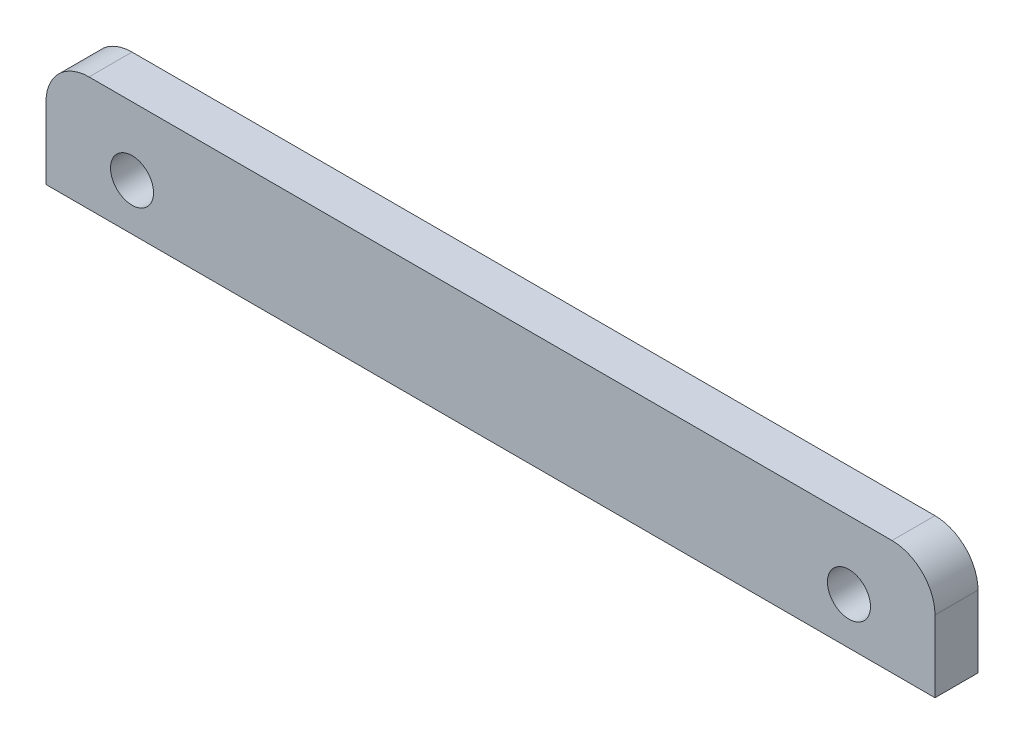
ISO-10303-21;
HEADER;
FILE_DESCRIPTION(('STEP AP214'),'2;1');
FILE_NAME('part.step','',(''),(''),'','','');
FILE_SCHEMA(('AUTOMOTIVE_DESIGN { 1 0 10303 214 1 1 1 1 }'));
ENDSEC;
DATA;
#1=APPLICATION_CONTEXT('core data for automotive mechanical design processes');
#2=APPLICATION_PROTOCOL_DEFINITION('international standard','automotive_design',2000,#1);
#3=PRODUCT_CONTEXT('',#1,'mechanical');
#4=PRODUCT('Part','Part','',(#3));
#5=PRODUCT_RELATED_PRODUCT_CATEGORY('part','',(#4));
#6=PRODUCT_DEFINITION_FORMATION('','',#4);
#7=PRODUCT_DEFINITION_CONTEXT('part definition',#1,'design');
#8=PRODUCT_DEFINITION('design','',#6,#7);
#9=PRODUCT_DEFINITION_SHAPE('','',#8);
#10=(LENGTH_UNIT() NAMED_UNIT(*) SI_UNIT(.MILLI.,.METRE.));
#11=(NAMED_UNIT(*) PLANE_ANGLE_UNIT() SI_UNIT($,.RADIAN.));
#12=(NAMED_UNIT(*) SI_UNIT($,.STERADIAN.) SOLID_ANGLE_UNIT());
#13=UNCERTAINTY_MEASURE_WITH_UNIT(LENGTH_MEASURE(1.E-05),#10,'distance_accuracy_value','');
#14=(GEOMETRIC_REPRESENTATION_CONTEXT(3) GLOBAL_UNCERTAINTY_ASSIGNED_CONTEXT((#13)) GLOBAL_UNIT_ASSIGNED_CONTEXT((#10,
#11,#12)) REPRESENTATION_CONTEXT('',''));
#15=CARTESIAN_POINT('',(0.,0.,0.));
#16=DIRECTION('',(0.,0.,1.));
#17=DIRECTION('',(1.,0.,0.));
#18=AXIS2_PLACEMENT_3D('',#15,#16,#17);
#19=CARTESIAN_POINT('',(-28.,2.5,3.));
#20=DIRECTION('',(0.,0.,1.));
#21=DIRECTION('',(1.,0.,0.));
#22=AXIS2_PLACEMENT_3D('',#19,#20,#21);
#23=PLANE('',#22);
#24=CARTESIAN_POINT('',(-25.,0.749999999999713,3.));
#25=DIRECTION('',(0.,0.,1.));
#26=DIRECTION('',(1.,0.,0.));
#27=AXIS2_PLACEMENT_3D('',#24,#25,#26);
#28=CIRCLE('',#27,1.5);
#29=CARTESIAN_POINT('',(-23.5,0.749999999999713,3.));
#30=VERTEX_POINT('',#29);
#31=EDGE_CURVE('E121',#30,#30,#28,.T.);
#32=ORIENTED_EDGE('',*,*,#31,.F.);
#33=EDGE_LOOP('',(#32));
#34=FACE_BOUND('',#33,.T.);
#35=DIRECTION('',(0.,1.,0.));
#36=VECTOR('',#35,1.);
#37=CARTESIAN_POINT('',(31.,2.5,3.));
#38=LINE('',#37,#36);
#39=CARTESIAN_POINT('',(31.,-2.5,3.));
#40=VERTEX_POINT('',#39);
#41=CARTESIAN_POINT('',(31.,2.5,3.));
#42=VERTEX_POINT('',#41);
#43=EDGE_CURVE('E128',#40,#42,#38,.T.);
#44=ORIENTED_EDGE('',*,*,#43,.T.);
#45=CARTESIAN_POINT('',(28.,2.5,3.));
#46=DIRECTION('',(0.,0.,1.));
#47=DIRECTION('',(-1.,0.,0.));
#48=AXIS2_PLACEMENT_3D('',#45,#46,#47);
#49=CIRCLE('',#48,3.);
#50=CARTESIAN_POINT('',(28.,5.5,3.));
#51=VERTEX_POINT('',#50);
#52=EDGE_CURVE('E86',#42,#51,#49,.T.);
#53=ORIENTED_EDGE('',*,*,#52,.T.);
#54=DIRECTION('',(-1.,0.,0.));
#55=VECTOR('',#54,1.);
#56=CARTESIAN_POINT('',(-28.,5.5,3.));
#57=LINE('',#56,#55);
#58=CARTESIAN_POINT('',(-28.,5.5,3.));
#59=VERTEX_POINT('',#58);
#60=EDGE_CURVE('E99',#51,#59,#57,.T.);
#61=ORIENTED_EDGE('',*,*,#60,.T.);
#62=CARTESIAN_POINT('',(-28.,2.5,3.));
#63=DIRECTION('',(0.,0.,1.));
#64=DIRECTION('',(1.,0.,0.));
#65=AXIS2_PLACEMENT_3D('',#62,#63,#64);
#66=CIRCLE('',#65,3.);
#67=CARTESIAN_POINT('',(-31.,2.5,3.));
#68=VERTEX_POINT('',#67);
#69=EDGE_CURVE('E93',#59,#68,#66,.T.);
#70=ORIENTED_EDGE('',*,*,#69,.T.);
#71=DIRECTION('',(0.,-1.,0.));
#72=VECTOR('',#71,1.);
#73=CARTESIAN_POINT('',(-31.,2.5,3.));
#74=LINE('',#73,#72);
#75=CARTESIAN_POINT('',(-31.,-2.5,3.));
#76=VERTEX_POINT('',#75);
#77=EDGE_CURVE('E97',#68,#76,#74,.T.);
#78=ORIENTED_EDGE('',*,*,#77,.T.);
#79=DIRECTION('',(1.,0.,0.));
#80=VECTOR('',#79,1.);
#81=CARTESIAN_POINT('',(-31.,-2.5,3.));
#82=LINE('',#81,#80);
#83=EDGE_CURVE('E49',#76,#40,#82,.T.);
#84=ORIENTED_EDGE('',*,*,#83,.T.);
#85=EDGE_LOOP('',(#44,#53,#61,#70,#78,#84));
#86=FACE_BOUND('',#85,.T.);
#87=CARTESIAN_POINT('',(25.,0.749999999999706,3.));
#88=DIRECTION('',(0.,0.,1.));
#89=DIRECTION('',(1.,0.,0.));
#90=AXIS2_PLACEMENT_3D('',#87,#88,#89);
#91=CIRCLE('',#90,1.5);
#92=CARTESIAN_POINT('',(26.5,0.749999999999706,3.));
#93=VERTEX_POINT('',#92);
#94=EDGE_CURVE('E170',#93,#93,#91,.T.);
#95=ORIENTED_EDGE('',*,*,#94,.F.);
#96=EDGE_LOOP('',(#95));
#97=FACE_BOUND('',#96,.T.);
#98=ADVANCED_FACE('F32',(#34,#86,#97),#23,.T.);
#99=CARTESIAN_POINT('',(-28.,2.5,0.));
#100=DIRECTION('',(0.,0.,1.));
#101=DIRECTION('',(1.,0.,0.));
#102=AXIS2_PLACEMENT_3D('',#99,#100,#101);
#103=PLANE('',#102);
#104=DIRECTION('',(0.,1.,0.));
#105=VECTOR('',#104,1.);
#106=CARTESIAN_POINT('',(31.,2.5,0.));
#107=LINE('',#106,#105);
#108=CARTESIAN_POINT('',(31.,-2.5,0.));
#109=VERTEX_POINT('',#108);
#110=CARTESIAN_POINT('',(31.,2.5,0.));
#111=VERTEX_POINT('',#110);
#112=EDGE_CURVE('E117',#109,#111,#107,.T.);
#113=ORIENTED_EDGE('',*,*,#112,.F.);
#114=DIRECTION('',(1.,0.,0.));
#115=VECTOR('',#114,1.);
#116=CARTESIAN_POINT('',(-31.,-2.5,0.));
#117=LINE('',#116,#115);
#118=CARTESIAN_POINT('',(-31.,-2.5,0.));
#119=VERTEX_POINT('',#118);
#120=EDGE_CURVE('E78',#119,#109,#117,.T.);
#121=ORIENTED_EDGE('',*,*,#120,.F.);
#122=DIRECTION('',(0.,-1.,0.));
#123=VECTOR('',#122,1.);
#124=CARTESIAN_POINT('',(-31.,2.5,0.));
#125=LINE('',#124,#123);
#126=CARTESIAN_POINT('',(-31.,2.5,0.));
#127=VERTEX_POINT('',#126);
#128=EDGE_CURVE('E72',#127,#119,#125,.T.);
#129=ORIENTED_EDGE('',*,*,#128,.F.);
#130=CARTESIAN_POINT('',(-28.,2.5,0.));
#131=DIRECTION('',(0.,0.,1.));
#132=DIRECTION('',(1.,0.,0.));
#133=AXIS2_PLACEMENT_3D('',#130,#131,#132);
#134=CIRCLE('',#133,3.);
#135=CARTESIAN_POINT('',(-28.,5.5,0.));
#136=VERTEX_POINT('',#135);
#137=EDGE_CURVE('E107',#136,#127,#134,.T.);
#138=ORIENTED_EDGE('',*,*,#137,.F.);
#139=DIRECTION('',(-1.,0.,0.));
#140=VECTOR('',#139,1.);
#141=CARTESIAN_POINT('',(-28.,5.5,0.));
#142=LINE('',#141,#140);
#143=CARTESIAN_POINT('',(28.,5.5,0.));
#144=VERTEX_POINT('',#143);
#145=EDGE_CURVE('E123',#144,#136,#142,.T.);
#146=ORIENTED_EDGE('',*,*,#145,.F.);
#147=CARTESIAN_POINT('',(28.,2.5,0.));
#148=DIRECTION('',(0.,0.,1.));
#149=DIRECTION('',(-1.,0.,0.));
#150=AXIS2_PLACEMENT_3D('',#147,#148,#149);
#151=CIRCLE('',#150,3.);
#152=EDGE_CURVE('E120',#111,#144,#151,.T.);
#153=ORIENTED_EDGE('',*,*,#152,.F.);
#154=EDGE_LOOP('',(#113,#121,#129,#138,#146,#153));
#155=FACE_BOUND('',#154,.T.);
#156=CARTESIAN_POINT('',(-25.,0.749999999999713,0.));
#157=DIRECTION('',(0.,0.,1.));
#158=DIRECTION('',(1.,0.,0.));
#159=AXIS2_PLACEMENT_3D('',#156,#157,#158);
#160=CIRCLE('',#159,1.5);
#161=CARTESIAN_POINT('',(-23.5,0.749999999999713,0.));
#162=VERTEX_POINT('',#161);
#163=EDGE_CURVE('E176',#162,#162,#160,.T.);
#164=ORIENTED_EDGE('',*,*,#163,.T.);
#165=EDGE_LOOP('',(#164));
#166=FACE_BOUND('',#165,.T.);
#167=CARTESIAN_POINT('',(25.,0.749999999999706,0.));
#168=DIRECTION('',(0.,0.,1.));
#169=DIRECTION('',(1.,0.,0.));
#170=AXIS2_PLACEMENT_3D('',#167,#168,#169);
#171=CIRCLE('',#170,1.5);
#172=CARTESIAN_POINT('',(26.5,0.749999999999706,0.));
#173=VERTEX_POINT('',#172);
#174=EDGE_CURVE('E173',#173,#173,#171,.T.);
#175=ORIENTED_EDGE('',*,*,#174,.T.);
#176=EDGE_LOOP('',(#175));
#177=FACE_BOUND('',#176,.T.);
#178=ADVANCED_FACE('F137',(#155,#166,#177),#103,.F.);
#179=CARTESIAN_POINT('',(31.,2.5,3.));
#180=DIRECTION('',(-1.,0.,0.));
#181=DIRECTION('',(0.,0.,1.));
#182=AXIS2_PLACEMENT_3D('',#179,#180,#181);
#183=PLANE('',#182);
#184=ORIENTED_EDGE('',*,*,#112,.T.);
#185=DIRECTION('',(0.,0.,-1.));
#186=VECTOR('',#185,1.);
#187=CARTESIAN_POINT('',(31.,2.5,3.));
#188=LINE('',#187,#186);
#189=EDGE_CURVE('E11',#42,#111,#188,.T.);
#190=ORIENTED_EDGE('',*,*,#189,.F.);
#191=ORIENTED_EDGE('',*,*,#43,.F.);
#192=DIRECTION('',(0.,0.,-1.));
#193=VECTOR('',#192,1.);
#194=CARTESIAN_POINT('',(31.,-2.5,3.));
#195=LINE('',#194,#193);
#196=EDGE_CURVE('E113',#40,#109,#195,.T.);
#197=ORIENTED_EDGE('',*,*,#196,.T.);
#198=EDGE_LOOP('',(#184,#190,#191,#197));
#199=FACE_BOUND('',#198,.T.);
#200=ADVANCED_FACE('F34',(#199),#183,.F.);
#201=CARTESIAN_POINT('',(28.,2.5,3.));
#202=DIRECTION('',(0.,0.,-1.));
#203=DIRECTION('',(-1.,0.,0.));
#204=AXIS2_PLACEMENT_3D('',#201,#202,#203);
#205=CYLINDRICAL_SURFACE('',#204,3.);
#206=ORIENTED_EDGE('',*,*,#152,.T.);
#207=DIRECTION('',(0.,0.,-1.));
#208=VECTOR('',#207,1.);
#209=CARTESIAN_POINT('',(28.,5.5,3.));
#210=LINE('',#209,#208);
#211=EDGE_CURVE('E41',#51,#144,#210,.T.);
#212=ORIENTED_EDGE('',*,*,#211,.F.);
#213=ORIENTED_EDGE('',*,*,#52,.F.);
#214=ORIENTED_EDGE('',*,*,#189,.T.);
#215=EDGE_LOOP('',(#206,#212,#213,#214));
#216=FACE_BOUND('',#215,.T.);
#217=ADVANCED_FACE('F217',(#216),#205,.T.);
#218=CARTESIAN_POINT('',(-28.,5.5,3.));
#219=DIRECTION('',(0.,-1.,0.));
#220=DIRECTION('',(0.,0.,-1.));
#221=AXIS2_PLACEMENT_3D('',#218,#219,#220);
#222=PLANE('',#221);
#223=ORIENTED_EDGE('',*,*,#145,.T.);
#224=DIRECTION('',(0.,0.,-1.));
#225=VECTOR('',#224,1.);
#226=CARTESIAN_POINT('',(-28.,5.5,3.));
#227=LINE('',#226,#225);
#228=EDGE_CURVE('E108',#59,#136,#227,.T.);
#229=ORIENTED_EDGE('',*,*,#228,.F.);
#230=ORIENTED_EDGE('',*,*,#60,.F.);
#231=ORIENTED_EDGE('',*,*,#211,.T.);
#232=EDGE_LOOP('',(#223,#229,#230,#231));
#233=FACE_BOUND('',#232,.T.);
#234=ADVANCED_FACE('F134',(#233),#222,.F.);
#235=CARTESIAN_POINT('',(-28.,2.5,3.));
#236=DIRECTION('',(0.,0.,-1.));
#237=DIRECTION('',(-1.,0.,0.));
#238=AXIS2_PLACEMENT_3D('',#235,#236,#237);
#239=CYLINDRICAL_SURFACE('',#238,3.);
#240=ORIENTED_EDGE('',*,*,#137,.T.);
#241=DIRECTION('',(0.,0.,-1.));
#242=VECTOR('',#241,1.);
#243=CARTESIAN_POINT('',(-31.,2.5,3.));
#244=LINE('',#243,#242);
#245=EDGE_CURVE('E104',#68,#127,#244,.T.);
#246=ORIENTED_EDGE('',*,*,#245,.F.);
#247=ORIENTED_EDGE('',*,*,#69,.F.);
#248=ORIENTED_EDGE('',*,*,#228,.T.);
#249=EDGE_LOOP('',(#240,#246,#247,#248));
#250=FACE_BOUND('',#249,.T.);
#251=ADVANCED_FACE('F105',(#250),#239,.T.);
#252=CARTESIAN_POINT('',(-31.,2.5,3.));
#253=DIRECTION('',(1.,0.,0.));
#254=DIRECTION('',(0.,0.,-1.));
#255=AXIS2_PLACEMENT_3D('',#252,#253,#254);
#256=PLANE('',#255);
#257=ORIENTED_EDGE('',*,*,#128,.T.);
#258=DIRECTION('',(0.,0.,-1.));
#259=VECTOR('',#258,1.);
#260=CARTESIAN_POINT('',(-31.,-2.5,3.));
#261=LINE('',#260,#259);
#262=EDGE_CURVE('E109',#76,#119,#261,.T.);
#263=ORIENTED_EDGE('',*,*,#262,.F.);
#264=ORIENTED_EDGE('',*,*,#77,.F.);
#265=ORIENTED_EDGE('',*,*,#245,.T.);
#266=EDGE_LOOP('',(#257,#263,#264,#265));
#267=FACE_BOUND('',#266,.T.);
#268=ADVANCED_FACE('F111',(#267),#256,.F.);
#269=CARTESIAN_POINT('',(-31.,-2.5,3.));
#270=DIRECTION('',(0.,1.,0.));
#271=DIRECTION('',(-1.,0.,0.));
#272=AXIS2_PLACEMENT_3D('',#269,#270,#271);
#273=PLANE('',#272);
#274=ORIENTED_EDGE('',*,*,#120,.T.);
#275=ORIENTED_EDGE('',*,*,#196,.F.);
#276=ORIENTED_EDGE('',*,*,#83,.F.);
#277=ORIENTED_EDGE('',*,*,#262,.T.);
#278=EDGE_LOOP('',(#274,#275,#276,#277));
#279=FACE_BOUND('',#278,.T.);
#280=ADVANCED_FACE('F142',(#279),#273,.F.);
#281=CARTESIAN_POINT('',(-25.,0.749999999999713,3.));
#282=DIRECTION('',(0.,0.,-1.));
#283=DIRECTION('',(-1.,0.,0.));
#284=AXIS2_PLACEMENT_3D('',#281,#282,#283);
#285=CYLINDRICAL_SURFACE('',#284,1.5);
#286=ORIENTED_EDGE('',*,*,#31,.T.);
#287=EDGE_LOOP('',(#286));
#288=FACE_BOUND('',#287,.T.);
#289=ORIENTED_EDGE('',*,*,#163,.F.);
#290=EDGE_LOOP('',(#289));
#291=FACE_BOUND('',#290,.T.);
#292=ADVANCED_FACE('F144',(#288,#291),#285,.F.);
#293=CARTESIAN_POINT('',(25.,0.749999999999706,3.));
#294=DIRECTION('',(0.,0.,-1.));
#295=DIRECTION('',(-1.,0.,0.));
#296=AXIS2_PLACEMENT_3D('',#293,#294,#295);
#297=CYLINDRICAL_SURFACE('',#296,1.5);
#298=ORIENTED_EDGE('',*,*,#94,.T.);
#299=EDGE_LOOP('',(#298));
#300=FACE_BOUND('',#299,.T.);
#301=ORIENTED_EDGE('',*,*,#174,.F.);
#302=EDGE_LOOP('',(#301));
#303=FACE_BOUND('',#302,.T.);
#304=ADVANCED_FACE('F150',(#300,#303),#297,.F.);
#305=CLOSED_SHELL('',(#98,#178,#200,#217,#234,#251,#268,#280,#292,#304));
#306=MANIFOLD_SOLID_BREP('B2',#305);
#307=ADVANCED_BREP_SHAPE_REPRESENTATION('',(#18,#306),#14);
#308=SHAPE_DEFINITION_REPRESENTATION(#9,#307);
ENDSEC;
END-ISO-10303-21;
